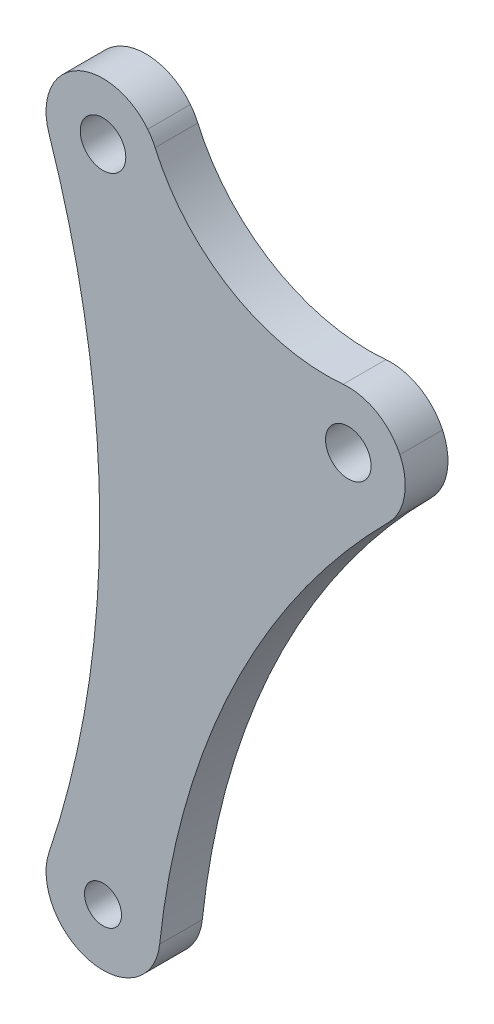
ISO-10303-21;
HEADER;
FILE_DESCRIPTION(('STEP AP214'),'2;1');
FILE_NAME('part.step','',(''),(''),'','','');
FILE_SCHEMA(('AUTOMOTIVE_DESIGN { 1 0 10303 214 1 1 1 1 }'));
ENDSEC;
DATA;
#1=APPLICATION_CONTEXT('core data for automotive mechanical design processes');
#2=APPLICATION_PROTOCOL_DEFINITION('international standard','automotive_design',2000,#1);
#3=PRODUCT_CONTEXT('',#1,'mechanical');
#4=PRODUCT('Part','Part','',(#3));
#5=PRODUCT_RELATED_PRODUCT_CATEGORY('part','',(#4));
#6=PRODUCT_DEFINITION_FORMATION('','',#4);
#7=PRODUCT_DEFINITION_CONTEXT('part definition',#1,'design');
#8=PRODUCT_DEFINITION('design','',#6,#7);
#9=PRODUCT_DEFINITION_SHAPE('','',#8);
#10=(LENGTH_UNIT() NAMED_UNIT(*) SI_UNIT(.MILLI.,.METRE.));
#11=(NAMED_UNIT(*) PLANE_ANGLE_UNIT() SI_UNIT($,.RADIAN.));
#12=(NAMED_UNIT(*) SI_UNIT($,.STERADIAN.) SOLID_ANGLE_UNIT());
#13=UNCERTAINTY_MEASURE_WITH_UNIT(LENGTH_MEASURE(1.E-05),#10,'distance_accuracy_value','');
#14=(GEOMETRIC_REPRESENTATION_CONTEXT(3) GLOBAL_UNCERTAINTY_ASSIGNED_CONTEXT((#13)) GLOBAL_UNIT_ASSIGNED_CONTEXT((#10,
#11,#12)) REPRESENTATION_CONTEXT('',''));
#15=CARTESIAN_POINT('',(0.,0.,0.));
#16=DIRECTION('',(0.,0.,1.));
#17=DIRECTION('',(1.,0.,0.));
#18=AXIS2_PLACEMENT_3D('',#15,#16,#17);
#19=CARTESIAN_POINT('',(-3.29500242135915,15.9735026125684,3.));
#20=DIRECTION('',(-0.948465419700066,-0.316880652033501,0.));
#21=DIRECTION('',(0.316880652033501,-0.948465419700066,0.));
#22=AXIS2_PLACEMENT_3D('',#19,#20,#21);
#23=PLANE('',#22);
#24=DIRECTION('',(-0.316880652033501,0.948465419700066,0.));
#25=VECTOR('',#24,1.);
#26=CARTESIAN_POINT('',(-3.29500242135915,15.9735026125684,0.));
#27=LINE('',#26,#25);
#28=CARTESIAN_POINT('',(-3.29500242135916,15.9735026125684,0.));
#29=VERTEX_POINT('',#28);
#30=CARTESIAN_POINT('',(-3.31111584765589,16.0217322142726,0.));
#31=VERTEX_POINT('',#30);
#32=EDGE_CURVE('E166',#29,#31,#27,.T.);
#33=ORIENTED_EDGE('',*,*,#32,.F.);
#34=DIRECTION('',(0.,0.,-1.));
#35=VECTOR('',#34,1.);
#36=CARTESIAN_POINT('',(-3.29500242135916,15.9735026125684,3.));
#37=LINE('',#36,#35);
#38=CARTESIAN_POINT('',(-3.29500242135916,15.9735026125684,3.));
#39=VERTEX_POINT('',#38);
#40=EDGE_CURVE('E11',#39,#29,#37,.T.);
#41=ORIENTED_EDGE('',*,*,#40,.F.);
#42=DIRECTION('',(-0.316880652033501,0.948465419700066,0.));
#43=VECTOR('',#42,1.);
#44=CARTESIAN_POINT('',(-3.29500242135915,15.9735026125684,3.));
#45=LINE('',#44,#43);
#46=CARTESIAN_POINT('',(-3.31111584765589,16.0217322142726,3.));
#47=VERTEX_POINT('',#46);
#48=EDGE_CURVE('E211',#39,#47,#45,.T.);
#49=ORIENTED_EDGE('',*,*,#48,.T.);
#50=DIRECTION('',(0.,0.,-1.));
#51=VECTOR('',#50,1.);
#52=CARTESIAN_POINT('',(-3.31111584765589,16.0217322142726,3.));
#53=LINE('',#52,#51);
#54=EDGE_CURVE('E42',#47,#31,#53,.T.);
#55=ORIENTED_EDGE('',*,*,#54,.T.);
#56=EDGE_LOOP('',(#33,#41,#49,#55));
#57=FACE_BOUND('',#56,.T.);
#58=ADVANCED_FACE('F39',(#57),#23,.T.);
#59=CARTESIAN_POINT('',(-68.6417788208372,-5.83262306867864,3.));
#60=DIRECTION('',(0.,0.,-1.));
#61=DIRECTION('',(-1.,0.,0.));
#62=AXIS2_PLACEMENT_3D('',#59,#60,#61);
#63=CYLINDRICAL_SURFACE('',#62,68.8891014822354);
#64=CARTESIAN_POINT('',(-68.6417788208372,-5.83262306867864,0.));
#65=DIRECTION('',(0.,0.,1.));
#66=DIRECTION('',(1.,0.,0.));
#67=AXIS2_PLACEMENT_3D('',#64,#65,#66);
#68=CIRCLE('',#67,68.8891014822354);
#69=CARTESIAN_POINT('',(-3.31325833207985,-27.6933804613157,0.));
#70=VERTEX_POINT('',#69);
#71=EDGE_CURVE('E208',#70,#29,#68,.T.);
#72=ORIENTED_EDGE('',*,*,#71,.F.);
#73=DIRECTION('',(0.,0.,-1.));
#74=VECTOR('',#73,1.);
#75=CARTESIAN_POINT('',(-3.31325833207985,-27.6933804613157,3.));
#76=LINE('',#75,#74);
#77=CARTESIAN_POINT('',(-3.31325833207985,-27.6933804613157,3.));
#78=VERTEX_POINT('',#77);
#79=EDGE_CURVE('E49',#78,#70,#76,.T.);
#80=ORIENTED_EDGE('',*,*,#79,.F.);
#81=CARTESIAN_POINT('',(-68.6417788208372,-5.83262306867864,3.));
#82=DIRECTION('',(0.,0.,1.));
#83=DIRECTION('',(1.,0.,0.));
#84=AXIS2_PLACEMENT_3D('',#81,#82,#83);
#85=CIRCLE('',#84,68.8891014822354);
#86=EDGE_CURVE('E152',#78,#39,#85,.T.);
#87=ORIENTED_EDGE('',*,*,#86,.T.);
#88=ORIENTED_EDGE('',*,*,#40,.T.);
#89=EDGE_LOOP('',(#72,#80,#87,#88));
#90=FACE_BOUND('',#89,.T.);
#91=ADVANCED_FACE('F241',(#90),#63,.F.);
#92=CARTESIAN_POINT('',(0.483386624261685,-28.9615161353038,3.));
#93=DIRECTION('',(0.,0.,-1.));
#94=DIRECTION('',(-1.,0.,0.));
#95=AXIS2_PLACEMENT_3D('',#92,#93,#94);
#96=CYLINDRICAL_SURFACE('',#95,4.00283412248809);
#97=CARTESIAN_POINT('',(0.483386624261685,-28.9615161353038,0.));
#98=DIRECTION('',(0.,0.,-1.));
#99=DIRECTION('',(-1.,0.,0.));
#100=AXIS2_PLACEMENT_3D('',#97,#98,#99);
#101=CIRCLE('',#100,4.00283412248809);
#102=CARTESIAN_POINT('',(-2.31525833207982,-31.8233804613157,0.));
#103=VERTEX_POINT('',#102);
#104=EDGE_CURVE('E138',#103,#70,#101,.T.);
#105=ORIENTED_EDGE('',*,*,#104,.F.);
#106=DIRECTION('',(0.,0.,-1.));
#107=VECTOR('',#106,1.);
#108=CARTESIAN_POINT('',(-2.31525833207982,-31.8233804613157,3.));
#109=LINE('',#108,#107);
#110=CARTESIAN_POINT('',(-2.31525833207982,-31.8233804613157,3.));
#111=VERTEX_POINT('',#110);
#112=EDGE_CURVE('E133',#111,#103,#109,.T.);
#113=ORIENTED_EDGE('',*,*,#112,.F.);
#114=CARTESIAN_POINT('',(0.483386624261685,-28.9615161353038,3.));
#115=DIRECTION('',(0.,0.,-1.));
#116=DIRECTION('',(-1.,0.,0.));
#117=AXIS2_PLACEMENT_3D('',#114,#115,#116);
#118=CIRCLE('',#117,4.00283412248809);
#119=EDGE_CURVE('E136',#111,#78,#118,.T.);
#120=ORIENTED_EDGE('',*,*,#119,.T.);
#121=ORIENTED_EDGE('',*,*,#79,.T.);
#122=EDGE_LOOP('',(#105,#113,#120,#121));
#123=FACE_BOUND('',#122,.T.);
#124=ADVANCED_FACE('F135',(#123),#96,.T.);
#125=CARTESIAN_POINT('',(0.479796831546224,-28.964156902197,3.));
#126=DIRECTION('',(0.,0.,-1.));
#127=DIRECTION('',(-1.,0.,0.));
#128=AXIS2_PLACEMENT_3D('',#125,#126,#127);
#129=CYLINDRICAL_SURFACE('',#128,3.99843628544105);
#130=CARTESIAN_POINT('',(0.479796831546224,-28.964156902197,0.));
#131=DIRECTION('',(0.,0.,-1.));
#132=DIRECTION('',(-1.,0.,0.));
#133=AXIS2_PLACEMENT_3D('',#130,#131,#132);
#134=CIRCLE('',#133,3.99843628544105);
#135=CARTESIAN_POINT('',(1.83374166792016,-32.7263804613158,0.));
#136=VERTEX_POINT('',#135);
#137=EDGE_CURVE('E203',#136,#103,#134,.T.);
#138=ORIENTED_EDGE('',*,*,#137,.F.);
#139=DIRECTION('',(0.,0.,-1.));
#140=VECTOR('',#139,1.);
#141=CARTESIAN_POINT('',(1.83374166792016,-32.7263804613158,3.));
#142=LINE('',#141,#140);
#143=CARTESIAN_POINT('',(1.83374166792016,-32.7263804613158,3.));
#144=VERTEX_POINT('',#143);
#145=EDGE_CURVE('E144',#144,#136,#142,.T.);
#146=ORIENTED_EDGE('',*,*,#145,.F.);
#147=CARTESIAN_POINT('',(0.479796831546224,-28.964156902197,3.));
#148=DIRECTION('',(0.,0.,-1.));
#149=DIRECTION('',(-1.,0.,0.));
#150=AXIS2_PLACEMENT_3D('',#147,#148,#149);
#151=CIRCLE('',#150,3.99843628544105);
#152=EDGE_CURVE('E150',#144,#111,#151,.T.);
#153=ORIENTED_EDGE('',*,*,#152,.T.);
#154=ORIENTED_EDGE('',*,*,#112,.T.);
#155=EDGE_LOOP('',(#138,#146,#153,#154));
#156=FACE_BOUND('',#155,.T.);
#157=ADVANCED_FACE('F155',(#156),#129,.T.);
#158=CARTESIAN_POINT('',(0.482561588190804,-28.961601368962,3.));
#159=DIRECTION('',(0.,0.,-1.));
#160=DIRECTION('',(-1.,0.,0.));
#161=AXIS2_PLACEMENT_3D('',#158,#159,#160);
#162=CYLINDRICAL_SURFACE('',#161,3.99990615165925);
#163=CARTESIAN_POINT('',(0.482561588190804,-28.961601368962,0.));
#164=DIRECTION('',(0.,0.,-1.));
#165=DIRECTION('',(-1.,0.,0.));
#166=AXIS2_PLACEMENT_3D('',#163,#164,#165);
#167=CIRCLE('',#166,3.99990615165925);
#168=CARTESIAN_POINT('',(4.45974166792016,-29.3873804613157,0.));
#169=VERTEX_POINT('',#168);
#170=EDGE_CURVE('E199',#169,#136,#167,.T.);
#171=ORIENTED_EDGE('',*,*,#170,.F.);
#172=DIRECTION('',(0.,0.,-1.));
#173=VECTOR('',#172,1.);
#174=CARTESIAN_POINT('',(4.45974166792016,-29.3873804613157,3.));
#175=LINE('',#174,#173);
#176=CARTESIAN_POINT('',(4.45974166792016,-29.3873804613157,3.));
#177=VERTEX_POINT('',#176);
#178=EDGE_CURVE('E217',#177,#169,#175,.T.);
#179=ORIENTED_EDGE('',*,*,#178,.F.);
#180=CARTESIAN_POINT('',(0.482561588190804,-28.961601368962,3.));
#181=DIRECTION('',(0.,0.,-1.));
#182=DIRECTION('',(-1.,0.,0.));
#183=AXIS2_PLACEMENT_3D('',#180,#181,#182);
#184=CIRCLE('',#183,3.99990615165925);
#185=EDGE_CURVE('E157',#177,#144,#184,.T.);
#186=ORIENTED_EDGE('',*,*,#185,.T.);
#187=ORIENTED_EDGE('',*,*,#145,.T.);
#188=EDGE_LOOP('',(#171,#179,#186,#187));
#189=FACE_BOUND('',#188,.T.);
#190=ADVANCED_FACE('F254',(#189),#162,.T.);
#191=CARTESIAN_POINT('',(60.2314584027506,-35.319694057371,3.));
#192=DIRECTION('',(0.,0.,-1.));
#193=DIRECTION('',(-1.,0.,0.));
#194=AXIS2_PLACEMENT_3D('',#191,#192,#193);
#195=CYLINDRICAL_SURFACE('',#194,56.0863328463549);
#196=CARTESIAN_POINT('',(60.2314584027506,-35.319694057371,0.));
#197=DIRECTION('',(0.,0.,1.));
#198=DIRECTION('',(1.,0.,0.));
#199=AXIS2_PLACEMENT_3D('',#196,#197,#198);
#200=CIRCLE('',#199,56.0863328463549);
#201=CARTESIAN_POINT('',(20.5427416679202,4.30961953868434,0.));
#202=VERTEX_POINT('',#201);
#203=EDGE_CURVE('E195',#202,#169,#200,.T.);
#204=ORIENTED_EDGE('',*,*,#203,.F.);
#205=DIRECTION('',(0.,0.,-1.));
#206=VECTOR('',#205,1.);
#207=CARTESIAN_POINT('',(20.5427416679202,4.30961953868434,3.));
#208=LINE('',#207,#206);
#209=CARTESIAN_POINT('',(20.5427416679202,4.30961953868434,3.));
#210=VERTEX_POINT('',#209);
#211=EDGE_CURVE('E220',#210,#202,#208,.T.);
#212=ORIENTED_EDGE('',*,*,#211,.F.);
#213=CARTESIAN_POINT('',(60.2314584027506,-35.319694057371,3.));
#214=DIRECTION('',(0.,0.,1.));
#215=DIRECTION('',(1.,0.,0.));
#216=AXIS2_PLACEMENT_3D('',#213,#214,#215);
#217=CIRCLE('',#216,56.0863328463549);
#218=EDGE_CURVE('E160',#210,#177,#217,.T.);
#219=ORIENTED_EDGE('',*,*,#218,.T.);
#220=ORIENTED_EDGE('',*,*,#178,.T.);
#221=EDGE_LOOP('',(#204,#212,#219,#220));
#222=FACE_BOUND('',#221,.T.);
#223=ADVANCED_FACE('F257',(#222),#195,.F.);
#224=CARTESIAN_POINT('',(17.7098992293805,7.13570474073715,3.));
#225=DIRECTION('',(0.,0.,-1.));
#226=DIRECTION('',(-1.,0.,0.));
#227=AXIS2_PLACEMENT_3D('',#224,#225,#226);
#228=CYLINDRICAL_SURFACE('',#227,4.00146896162562);
#229=CARTESIAN_POINT('',(17.7098992293805,7.13570474073715,0.));
#230=DIRECTION('',(0.,0.,-1.));
#231=DIRECTION('',(-1.,0.,0.));
#232=AXIS2_PLACEMENT_3D('',#229,#230,#231);
#233=CIRCLE('',#232,4.00146896162562);
#234=CARTESIAN_POINT('',(21.3337416679202,8.83261953868433,0.));
#235=VERTEX_POINT('',#234);
#236=EDGE_CURVE('E191',#235,#202,#233,.T.);
#237=ORIENTED_EDGE('',*,*,#236,.F.);
#238=DIRECTION('',(0.,0.,-1.));
#239=VECTOR('',#238,1.);
#240=CARTESIAN_POINT('',(21.3337416679202,8.83261953868433,3.));
#241=LINE('',#240,#239);
#242=CARTESIAN_POINT('',(21.3337416679202,8.83261953868433,3.));
#243=VERTEX_POINT('',#242);
#244=EDGE_CURVE('E223',#243,#235,#241,.T.);
#245=ORIENTED_EDGE('',*,*,#244,.F.);
#246=CARTESIAN_POINT('',(17.7098992293805,7.13570474073715,3.));
#247=DIRECTION('',(0.,0.,-1.));
#248=DIRECTION('',(-1.,0.,0.));
#249=AXIS2_PLACEMENT_3D('',#246,#247,#248);
#250=CIRCLE('',#249,4.00146896162562);
#251=EDGE_CURVE('E353',#243,#210,#250,.T.);
#252=ORIENTED_EDGE('',*,*,#251,.T.);
#253=ORIENTED_EDGE('',*,*,#211,.T.);
#254=EDGE_LOOP('',(#237,#245,#252,#253));
#255=FACE_BOUND('',#254,.T.);
#256=ADVANCED_FACE('F261',(#255),#228,.T.);
#257=CARTESIAN_POINT('',(17.7090330265207,7.13333815317174,3.));
#258=DIRECTION('',(0.,0.,-1.));
#259=DIRECTION('',(-1.,0.,0.));
#260=AXIS2_PLACEMENT_3D('',#257,#258,#259);
#261=CYLINDRICAL_SURFACE('',#260,4.00325741892597);
#262=CARTESIAN_POINT('',(17.7090330265207,7.13333815317174,0.));
#263=DIRECTION('',(0.,0.,-1.));
#264=DIRECTION('',(-1.,0.,0.));
#265=AXIS2_PLACEMENT_3D('',#262,#263,#264);
#266=CIRCLE('',#265,4.00325741892597);
#267=CARTESIAN_POINT('',(17.3517416679201,11.1206195386843,0.));
#268=VERTEX_POINT('',#267);
#269=EDGE_CURVE('E187',#268,#235,#266,.T.);
#270=ORIENTED_EDGE('',*,*,#269,.F.);
#271=DIRECTION('',(0.,0.,-1.));
#272=VECTOR('',#271,1.);
#273=CARTESIAN_POINT('',(17.3517416679201,11.1206195386843,3.));
#274=LINE('',#273,#272);
#275=CARTESIAN_POINT('',(17.3517416679201,11.1206195386843,3.));
#276=VERTEX_POINT('',#275);
#277=EDGE_CURVE('E226',#276,#268,#274,.T.);
#278=ORIENTED_EDGE('',*,*,#277,.F.);
#279=CARTESIAN_POINT('',(17.7090330265207,7.13333815317174,3.));
#280=DIRECTION('',(0.,0.,-1.));
#281=DIRECTION('',(-1.,0.,0.));
#282=AXIS2_PLACEMENT_3D('',#279,#280,#281);
#283=CIRCLE('',#282,4.00325741892597);
#284=EDGE_CURVE('E349',#276,#243,#283,.T.);
#285=ORIENTED_EDGE('',*,*,#284,.T.);
#286=ORIENTED_EDGE('',*,*,#244,.T.);
#287=EDGE_LOOP('',(#270,#278,#285,#286));
#288=FACE_BOUND('',#287,.T.);
#289=ADVANCED_FACE('F265',(#288),#261,.T.);
#290=CARTESIAN_POINT('',(16.1692678714975,24.2145303741101,3.));
#291=DIRECTION('',(0.,0.,-1.));
#292=DIRECTION('',(-1.,0.,0.));
#293=AXIS2_PLACEMENT_3D('',#290,#291,#292);
#294=CYLINDRICAL_SURFACE('',#293,13.1471953376112);
#295=CARTESIAN_POINT('',(16.1692678714975,24.2145303741101,0.));
#296=DIRECTION('',(0.,0.,1.));
#297=DIRECTION('',(1.,0.,0.));
#298=AXIS2_PLACEMENT_3D('',#295,#296,#297);
#299=CIRCLE('',#298,13.1471953376112);
#300=CARTESIAN_POINT('',(4.14074166790856,18.9076195386792,0.));
#301=VERTEX_POINT('',#300);
#302=EDGE_CURVE('E183',#301,#268,#299,.T.);
#303=ORIENTED_EDGE('',*,*,#302,.F.);
#304=DIRECTION('',(0.,0.,-1.));
#305=VECTOR('',#304,1.);
#306=CARTESIAN_POINT('',(4.14074166790856,18.9076195386792,3.));
#307=LINE('',#306,#305);
#308=CARTESIAN_POINT('',(4.14074166790856,18.9076195386792,3.));
#309=VERTEX_POINT('',#308);
#310=EDGE_CURVE('E229',#309,#301,#307,.T.);
#311=ORIENTED_EDGE('',*,*,#310,.F.);
#312=CARTESIAN_POINT('',(16.1692678714975,24.2145303741101,3.));
#313=DIRECTION('',(0.,0.,1.));
#314=DIRECTION('',(1.,0.,0.));
#315=AXIS2_PLACEMENT_3D('',#312,#313,#314);
#316=CIRCLE('',#315,13.1471953376112);
#317=EDGE_CURVE('E345',#309,#276,#316,.T.);
#318=ORIENTED_EDGE('',*,*,#317,.T.);
#319=ORIENTED_EDGE('',*,*,#277,.T.);
#320=EDGE_LOOP('',(#303,#311,#318,#319));
#321=FACE_BOUND('',#320,.T.);
#322=ADVANCED_FACE('F269',(#321),#294,.F.);
#323=CARTESIAN_POINT('',(0.481247254969111,17.2907068217013,3.));
#324=DIRECTION('',(0.,0.,-1.));
#325=DIRECTION('',(-1.,0.,0.));
#326=AXIS2_PLACEMENT_3D('',#323,#324,#325);
#327=CYLINDRICAL_SURFACE('',#326,4.00078818392827);
#328=CARTESIAN_POINT('',(0.481247254969111,17.2907068217013,0.));
#329=DIRECTION('',(0.,0.,-1.));
#330=DIRECTION('',(-1.,0.,0.));
#331=AXIS2_PLACEMENT_3D('',#328,#329,#330);
#332=CIRCLE('',#331,4.00078818392827);
#333=CARTESIAN_POINT('',(3.61938337629938,19.7723207676369,0.));
#334=VERTEX_POINT('',#333);
#335=EDGE_CURVE('E179',#334,#301,#332,.T.);
#336=ORIENTED_EDGE('',*,*,#335,.F.);
#337=DIRECTION('',(0.,0.,-1.));
#338=VECTOR('',#337,1.);
#339=CARTESIAN_POINT('',(3.61938337629938,19.7723207676369,3.));
#340=LINE('',#339,#338);
#341=CARTESIAN_POINT('',(3.61938337629938,19.7723207676369,3.));
#342=VERTEX_POINT('',#341);
#343=EDGE_CURVE('E232',#342,#334,#340,.T.);
#344=ORIENTED_EDGE('',*,*,#343,.F.);
#345=CARTESIAN_POINT('',(0.481247254969111,17.2907068217013,3.));
#346=DIRECTION('',(0.,0.,-1.));
#347=DIRECTION('',(-1.,0.,0.));
#348=AXIS2_PLACEMENT_3D('',#345,#346,#347);
#349=CIRCLE('',#348,4.00078818392827);
#350=EDGE_CURVE('E341',#342,#309,#349,.T.);
#351=ORIENTED_EDGE('',*,*,#350,.T.);
#352=ORIENTED_EDGE('',*,*,#310,.T.);
#353=EDGE_LOOP('',(#336,#344,#351,#352));
#354=FACE_BOUND('',#353,.T.);
#355=ADVANCED_FACE('F273',(#354),#327,.T.);
#356=CARTESIAN_POINT('',(0.481187557855492,17.2906596136822,3.));
#357=DIRECTION('',(0.,0.,-1.));
#358=DIRECTION('',(-1.,0.,0.));
#359=AXIS2_PLACEMENT_3D('',#356,#357,#358);
#360=CYLINDRICAL_SURFACE('',#359,4.00086429136834);
#361=CARTESIAN_POINT('',(0.481187557855492,17.2906596136822,0.));
#362=DIRECTION('',(0.,0.,-1.));
#363=DIRECTION('',(-1.,0.,0.));
#364=AXIS2_PLACEMENT_3D('',#361,#362,#363);
#365=CIRCLE('',#364,4.00086429136834);
#366=CARTESIAN_POINT('',(-3.3131158476559,16.0217322142726,0.));
#367=VERTEX_POINT('',#366);
#368=EDGE_CURVE('E175',#367,#334,#365,.T.);
#369=ORIENTED_EDGE('',*,*,#368,.F.);
#370=DIRECTION('',(0.,0.,-1.));
#371=VECTOR('',#370,1.);
#372=CARTESIAN_POINT('',(-3.3131158476559,16.0217322142726,3.));
#373=LINE('',#372,#371);
#374=CARTESIAN_POINT('',(-3.3131158476559,16.0217322142726,3.));
#375=VERTEX_POINT('',#374);
#376=EDGE_CURVE('E234',#375,#367,#373,.T.);
#377=ORIENTED_EDGE('',*,*,#376,.F.);
#378=CARTESIAN_POINT('',(0.481187557855492,17.2906596136822,3.));
#379=DIRECTION('',(0.,0.,-1.));
#380=DIRECTION('',(-1.,0.,0.));
#381=AXIS2_PLACEMENT_3D('',#378,#379,#380);
#382=CIRCLE('',#381,4.00086429136834);
#383=EDGE_CURVE('E337',#375,#342,#382,.T.);
#384=ORIENTED_EDGE('',*,*,#383,.T.);
#385=ORIENTED_EDGE('',*,*,#343,.T.);
#386=EDGE_LOOP('',(#369,#377,#384,#385));
#387=FACE_BOUND('',#386,.T.);
#388=ADVANCED_FACE('F277',(#387),#360,.T.);
#389=CARTESIAN_POINT('',(-3.31111584765589,16.0217322142726,3.));
#390=DIRECTION('',(0.,-1.,0.));
#391=DIRECTION('',(0.,0.,-1.));
#392=AXIS2_PLACEMENT_3D('',#389,#390,#391);
#393=PLANE('',#392);
#394=DIRECTION('',(-1.,0.,0.));
#395=VECTOR('',#394,1.);
#396=CARTESIAN_POINT('',(-3.31111584765589,16.0217322142726,0.));
#397=LINE('',#396,#395);
#398=EDGE_CURVE('E170',#31,#367,#397,.T.);
#399=ORIENTED_EDGE('',*,*,#398,.F.);
#400=ORIENTED_EDGE('',*,*,#54,.F.);
#401=DIRECTION('',(-1.,0.,0.));
#402=VECTOR('',#401,1.);
#403=CARTESIAN_POINT('',(-3.31111584765589,16.0217322142726,3.));
#404=LINE('',#403,#402);
#405=EDGE_CURVE('E334',#47,#375,#404,.T.);
#406=ORIENTED_EDGE('',*,*,#405,.T.);
#407=ORIENTED_EDGE('',*,*,#376,.T.);
#408=EDGE_LOOP('',(#399,#400,#406,#407));
#409=FACE_BOUND('',#408,.T.);
#410=ADVANCED_FACE('F238',(#409),#393,.T.);
#411=CARTESIAN_POINT('',(0.481187557855492,17.2906596136822,3.));
#412=DIRECTION('',(0.,0.,-1.));
#413=DIRECTION('',(-1.,0.,0.));
#414=AXIS2_PLACEMENT_3D('',#411,#412,#413);
#415=PLANE('',#414);
#416=CARTESIAN_POINT('',(0.480884152344096,17.2912322142726,3.));
#417=DIRECTION('',(0.,0.,1.));
#418=DIRECTION('',(1.,0.,0.));
#419=AXIS2_PLACEMENT_3D('',#416,#417,#418);
#420=CIRCLE('',#419,1.6);
#421=CARTESIAN_POINT('',(2.0808841523441,17.2912322142726,3.));
#422=VERTEX_POINT('',#421);
#423=EDGE_CURVE('E311',#422,#422,#420,.T.);
#424=ORIENTED_EDGE('',*,*,#423,.F.);
#425=EDGE_LOOP('',(#424));
#426=FACE_BOUND('',#425,.T.);
#427=CARTESIAN_POINT('',(17.7113841523441,7.13623221427256,3.));
#428=DIRECTION('',(0.,0.,1.));
#429=DIRECTION('',(1.,0.,0.));
#430=AXIS2_PLACEMENT_3D('',#427,#428,#429);
#431=CIRCLE('',#430,1.6);
#432=CARTESIAN_POINT('',(19.3113841523441,7.13623221427256,3.));
#433=VERTEX_POINT('',#432);
#434=EDGE_CURVE('E320',#433,#433,#431,.T.);
#435=ORIENTED_EDGE('',*,*,#434,.F.);
#436=EDGE_LOOP('',(#435));
#437=FACE_BOUND('',#436,.T.);
#438=CARTESIAN_POINT('',(0.480884152344096,-28.9627677857274,3.));
#439=DIRECTION('',(0.,0.,-1.));
#440=DIRECTION('',(1.,0.,0.));
#441=AXIS2_PLACEMENT_3D('',#438,#439,#440);
#442=CIRCLE('',#441,1.3);
#443=CARTESIAN_POINT('',(1.7808841523441,-28.9627677857274,3.));
#444=VERTEX_POINT('',#443);
#445=EDGE_CURVE('E171',#444,#444,#442,.T.);
#446=ORIENTED_EDGE('',*,*,#445,.T.);
#447=EDGE_LOOP('',(#446));
#448=FACE_BOUND('',#447,.T.);
#449=ORIENTED_EDGE('',*,*,#48,.F.);
#450=ORIENTED_EDGE('',*,*,#86,.F.);
#451=ORIENTED_EDGE('',*,*,#119,.F.);
#452=ORIENTED_EDGE('',*,*,#152,.F.);
#453=ORIENTED_EDGE('',*,*,#185,.F.);
#454=ORIENTED_EDGE('',*,*,#218,.F.);
#455=ORIENTED_EDGE('',*,*,#251,.F.);
#456=ORIENTED_EDGE('',*,*,#284,.F.);
#457=ORIENTED_EDGE('',*,*,#317,.F.);
#458=ORIENTED_EDGE('',*,*,#350,.F.);
#459=ORIENTED_EDGE('',*,*,#383,.F.);
#460=ORIENTED_EDGE('',*,*,#405,.F.);
#461=EDGE_LOOP('',(#449,#450,#451,#452,#453,#454,#455,#456,#457,#458,#459,#460));
#462=FACE_BOUND('',#461,.T.);
#463=ADVANCED_FACE('F148',(#426,#437,#448,#462),#415,.F.);
#464=CARTESIAN_POINT('',(0.481187557855492,17.2906596136822,0.));
#465=DIRECTION('',(0.,0.,-1.));
#466=DIRECTION('',(-1.,0.,0.));
#467=AXIS2_PLACEMENT_3D('',#464,#465,#466);
#468=PLANE('',#467);
#469=CARTESIAN_POINT('',(0.480884152344096,17.2912322142726,0.));
#470=DIRECTION('',(0.,0.,1.));
#471=DIRECTION('',(1.,0.,0.));
#472=AXIS2_PLACEMENT_3D('',#469,#470,#471);
#473=CIRCLE('',#472,1.6);
#474=CARTESIAN_POINT('',(2.0808841523441,17.2912322142726,0.));
#475=VERTEX_POINT('',#474);
#476=EDGE_CURVE('E309',#475,#475,#473,.T.);
#477=ORIENTED_EDGE('',*,*,#476,.T.);
#478=EDGE_LOOP('',(#477));
#479=FACE_BOUND('',#478,.T.);
#480=CARTESIAN_POINT('',(17.7113841523441,7.13623221427256,0.));
#481=DIRECTION('',(0.,0.,1.));
#482=DIRECTION('',(1.,0.,0.));
#483=AXIS2_PLACEMENT_3D('',#480,#481,#482);
#484=CIRCLE('',#483,1.6);
#485=CARTESIAN_POINT('',(19.3113841523441,7.13623221427256,0.));
#486=VERTEX_POINT('',#485);
#487=EDGE_CURVE('E313',#486,#486,#484,.T.);
#488=ORIENTED_EDGE('',*,*,#487,.T.);
#489=EDGE_LOOP('',(#488));
#490=FACE_BOUND('',#489,.T.);
#491=CARTESIAN_POINT('',(0.480884152344096,-28.9627677857274,0.));
#492=DIRECTION('',(0.,0.,-1.));
#493=DIRECTION('',(1.,0.,0.));
#494=AXIS2_PLACEMENT_3D('',#491,#492,#493);
#495=CIRCLE('',#494,1.3);
#496=CARTESIAN_POINT('',(1.7808841523441,-28.9627677857274,0.));
#497=VERTEX_POINT('',#496);
#498=EDGE_CURVE('E317',#497,#497,#495,.T.);
#499=ORIENTED_EDGE('',*,*,#498,.F.);
#500=EDGE_LOOP('',(#499));
#501=FACE_BOUND('',#500,.T.);
#502=ORIENTED_EDGE('',*,*,#32,.T.);
#503=ORIENTED_EDGE('',*,*,#398,.T.);
#504=ORIENTED_EDGE('',*,*,#368,.T.);
#505=ORIENTED_EDGE('',*,*,#335,.T.);
#506=ORIENTED_EDGE('',*,*,#302,.T.);
#507=ORIENTED_EDGE('',*,*,#269,.T.);
#508=ORIENTED_EDGE('',*,*,#236,.T.);
#509=ORIENTED_EDGE('',*,*,#203,.T.);
#510=ORIENTED_EDGE('',*,*,#170,.T.);
#511=ORIENTED_EDGE('',*,*,#137,.T.);
#512=ORIENTED_EDGE('',*,*,#104,.T.);
#513=ORIENTED_EDGE('',*,*,#71,.T.);
#514=EDGE_LOOP('',(#502,#503,#504,#505,#506,#507,#508,#509,#510,#511,#512,#513));
#515=FACE_BOUND('',#514,.T.);
#516=ADVANCED_FACE('F240',(#479,#490,#501,#515),#468,.T.);
#517=CARTESIAN_POINT('',(0.480884152344096,-28.9627677857274,3.));
#518=DIRECTION('',(0.,0.,-1.));
#519=DIRECTION('',(-1.,0.,0.));
#520=AXIS2_PLACEMENT_3D('',#517,#518,#519);
#521=CYLINDRICAL_SURFACE('',#520,1.3);
#522=ORIENTED_EDGE('',*,*,#445,.F.);
#523=EDGE_LOOP('',(#522));
#524=FACE_BOUND('',#523,.T.);
#525=ORIENTED_EDGE('',*,*,#498,.T.);
#526=EDGE_LOOP('',(#525));
#527=FACE_BOUND('',#526,.T.);
#528=ADVANCED_FACE('F289',(#524,#527),#521,.F.);
#529=CARTESIAN_POINT('',(17.7113841523441,7.13623221427256,0.));
#530=DIRECTION('',(0.,0.,1.));
#531=DIRECTION('',(1.,0.,0.));
#532=AXIS2_PLACEMENT_3D('',#529,#530,#531);
#533=CYLINDRICAL_SURFACE('',#532,1.6);
#534=ORIENTED_EDGE('',*,*,#487,.F.);
#535=EDGE_LOOP('',(#534));
#536=FACE_BOUND('',#535,.T.);
#537=ORIENTED_EDGE('',*,*,#434,.T.);
#538=EDGE_LOOP('',(#537));
#539=FACE_BOUND('',#538,.T.);
#540=ADVANCED_FACE('F296',(#536,#539),#533,.F.);
#541=CARTESIAN_POINT('',(0.480884152344096,17.2912322142726,0.));
#542=DIRECTION('',(0.,0.,1.));
#543=DIRECTION('',(1.,0.,0.));
#544=AXIS2_PLACEMENT_3D('',#541,#542,#543);
#545=CYLINDRICAL_SURFACE('',#544,1.6);
#546=ORIENTED_EDGE('',*,*,#476,.F.);
#547=EDGE_LOOP('',(#546));
#548=FACE_BOUND('',#547,.T.);
#549=ORIENTED_EDGE('',*,*,#423,.T.);
#550=EDGE_LOOP('',(#549));
#551=FACE_BOUND('',#550,.T.);
#552=ADVANCED_FACE('F300',(#548,#551),#545,.F.);
#553=CLOSED_SHELL('',(#58,#91,#124,#157,#190,#223,#256,#289,#322,#355,#388,#410,#463,#516,#528,
#540,#552));
#554=MANIFOLD_SOLID_BREP('B2',#553);
#555=ADVANCED_BREP_SHAPE_REPRESENTATION('',(#18,#554),#14);
#556=SHAPE_DEFINITION_REPRESENTATION(#9,#555);
ENDSEC;
END-ISO-10303-21;
